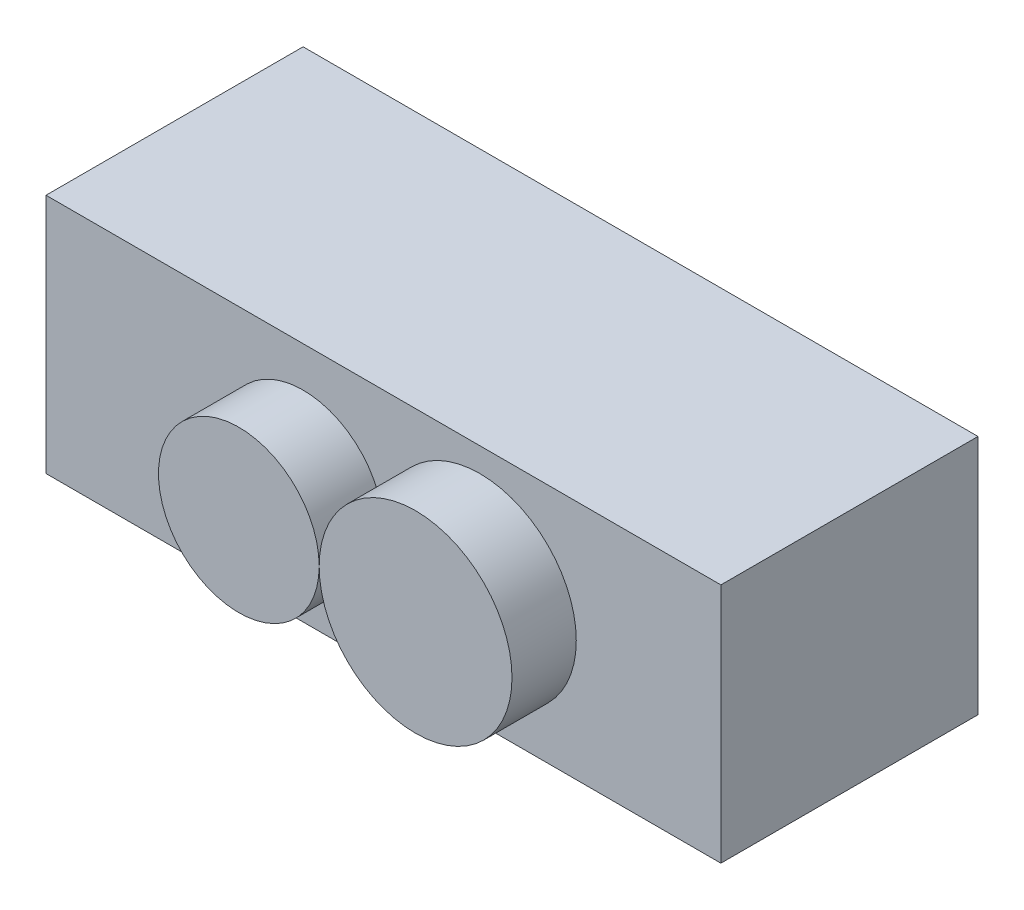
ISO-10303-21;
HEADER;
FILE_DESCRIPTION(('STEP AP214'),'2;1');
FILE_NAME('part.step','',(''),(''),'','','');
FILE_SCHEMA(('AUTOMOTIVE_DESIGN { 1 0 10303 214 1 1 1 1 }'));
ENDSEC;
DATA;
#1=APPLICATION_CONTEXT('core data for automotive mechanical design processes');
#2=APPLICATION_PROTOCOL_DEFINITION('international standard','automotive_design',2000,#1);
#3=PRODUCT_CONTEXT('',#1,'mechanical');
#4=PRODUCT('Part','Part','',(#3));
#5=PRODUCT_RELATED_PRODUCT_CATEGORY('part','',(#4));
#6=PRODUCT_DEFINITION_FORMATION('','',#4);
#7=PRODUCT_DEFINITION_CONTEXT('part definition',#1,'design');
#8=PRODUCT_DEFINITION('design','',#6,#7);
#9=PRODUCT_DEFINITION_SHAPE('','',#8);
#10=(LENGTH_UNIT() NAMED_UNIT(*) SI_UNIT(.MILLI.,.METRE.));
#11=(NAMED_UNIT(*) PLANE_ANGLE_UNIT() SI_UNIT($,.RADIAN.));
#12=(NAMED_UNIT(*) SI_UNIT($,.STERADIAN.) SOLID_ANGLE_UNIT());
#13=UNCERTAINTY_MEASURE_WITH_UNIT(LENGTH_MEASURE(1.E-05),#10,'distance_accuracy_value','');
#14=(GEOMETRIC_REPRESENTATION_CONTEXT(3) GLOBAL_UNCERTAINTY_ASSIGNED_CONTEXT((#13)) GLOBAL_UNIT_ASSIGNED_CONTEXT((#10,
#11,#12)) REPRESENTATION_CONTEXT('',''));
#15=CARTESIAN_POINT('',(0.,0.,0.));
#16=DIRECTION('',(0.,0.,1.));
#17=DIRECTION('',(1.,0.,0.));
#18=AXIS2_PLACEMENT_3D('',#15,#16,#17);
#19=CARTESIAN_POINT('',(-5.,0.,20.));
#20=DIRECTION('',(0.,0.,-1.));
#21=DIRECTION('',(-1.,0.,0.));
#22=AXIS2_PLACEMENT_3D('',#19,#20,#21);
#23=CYLINDRICAL_SURFACE('',#22,5.);
#24=CARTESIAN_POINT('',(-5.,0.,16.));
#25=DIRECTION('',(0.,0.,1.));
#26=DIRECTION('',(1.,0.,0.));
#27=AXIS2_PLACEMENT_3D('',#24,#25,#26);
#28=CIRCLE('',#27,5.);
#29=CARTESIAN_POINT('',(0.,0.,16.));
#30=VERTEX_POINT('',#29);
#31=EDGE_CURVE('E12',#30,#30,#28,.T.);
#32=ORIENTED_EDGE('',*,*,#31,.T.);
#33=EDGE_LOOP('',(#32));
#34=FACE_BOUND('',#33,.T.);
#35=CARTESIAN_POINT('',(-5.,0.,20.));
#36=DIRECTION('',(0.,0.,1.));
#37=DIRECTION('',(1.,0.,0.));
#38=AXIS2_PLACEMENT_3D('',#35,#36,#37);
#39=CIRCLE('',#38,5.);
#40=CARTESIAN_POINT('',(0.,0.,20.));
#41=VERTEX_POINT('',#40);
#42=EDGE_CURVE('E66',#41,#41,#39,.T.);
#43=ORIENTED_EDGE('',*,*,#42,.F.);
#44=EDGE_LOOP('',(#43));
#45=FACE_BOUND('',#44,.T.);
#46=ADVANCED_FACE('F62',(#34,#45),#23,.T.);
#47=CARTESIAN_POINT('',(-5.,0.,20.));
#48=DIRECTION('',(0.,0.,1.));
#49=DIRECTION('',(1.,0.,0.));
#50=AXIS2_PLACEMENT_3D('',#47,#48,#49);
#51=PLANE('',#50);
#52=ORIENTED_EDGE('',*,*,#42,.T.);
#53=EDGE_LOOP('',(#52));
#54=FACE_BOUND('',#53,.T.);
#55=ADVANCED_FACE('F64',(#54),#51,.T.);
#56=CARTESIAN_POINT('',(-5.,0.,16.));
#57=DIRECTION('',(0.,0.,1.));
#58=DIRECTION('',(1.,0.,0.));
#59=AXIS2_PLACEMENT_3D('',#56,#57,#58);
#60=PLANE('',#59);
#61=ORIENTED_EDGE('',*,*,#31,.F.);
#62=EDGE_LOOP('',(#61));
#63=FACE_BOUND('',#62,.T.);
#64=ADVANCED_FACE('F81',(#63),#60,.F.);
#65=CLOSED_SHELL('',(#46,#55,#64));
#66=MANIFOLD_SOLID_BREP('B2',#65);
#67=CARTESIAN_POINT('',(6.,0.,20.));
#68=DIRECTION('',(0.,0.,-1.));
#69=DIRECTION('',(-1.,0.,0.));
#70=AXIS2_PLACEMENT_3D('',#67,#68,#69);
#71=CYLINDRICAL_SURFACE('',#70,6.);
#72=CARTESIAN_POINT('',(6.,0.,16.));
#73=DIRECTION('',(0.,0.,1.));
#74=DIRECTION('',(1.,0.,0.));
#75=AXIS2_PLACEMENT_3D('',#72,#73,#74);
#76=CIRCLE('',#75,6.);
#77=CARTESIAN_POINT('',(12.,0.,16.));
#78=VERTEX_POINT('',#77);
#79=EDGE_CURVE('E115',#78,#78,#76,.T.);
#80=ORIENTED_EDGE('',*,*,#79,.T.);
#81=EDGE_LOOP('',(#80));
#82=FACE_BOUND('',#81,.T.);
#83=CARTESIAN_POINT('',(6.,0.,20.));
#84=DIRECTION('',(0.,0.,1.));
#85=DIRECTION('',(1.,0.,0.));
#86=AXIS2_PLACEMENT_3D('',#83,#84,#85);
#87=CIRCLE('',#86,6.);
#88=CARTESIAN_POINT('',(12.,0.,20.));
#89=VERTEX_POINT('',#88);
#90=EDGE_CURVE('E61',#89,#89,#87,.T.);
#91=ORIENTED_EDGE('',*,*,#90,.F.);
#92=EDGE_LOOP('',(#91));
#93=FACE_BOUND('',#92,.T.);
#94=ADVANCED_FACE('F112',(#82,#93),#71,.T.);
#95=CARTESIAN_POINT('',(6.,0.,20.));
#96=DIRECTION('',(0.,0.,1.));
#97=DIRECTION('',(1.,0.,0.));
#98=AXIS2_PLACEMENT_3D('',#95,#96,#97);
#99=PLANE('',#98);
#100=ORIENTED_EDGE('',*,*,#90,.T.);
#101=EDGE_LOOP('',(#100));
#102=FACE_BOUND('',#101,.T.);
#103=ADVANCED_FACE('F128',(#102),#99,.T.);
#104=CARTESIAN_POINT('',(6.,0.,16.));
#105=DIRECTION('',(0.,0.,1.));
#106=DIRECTION('',(1.,0.,0.));
#107=AXIS2_PLACEMENT_3D('',#104,#105,#106);
#108=PLANE('',#107);
#109=ORIENTED_EDGE('',*,*,#79,.F.);
#110=EDGE_LOOP('',(#109));
#111=FACE_BOUND('',#110,.T.);
#112=ADVANCED_FACE('F126',(#111),#108,.F.);
#113=CLOSED_SHELL('',(#94,#103,#112));
#114=MANIFOLD_SOLID_BREP('B7',#113);
#115=CARTESIAN_POINT('',(21.,-7.5,16.));
#116=DIRECTION('',(-1.,0.,0.));
#117=DIRECTION('',(0.,0.,1.));
#118=AXIS2_PLACEMENT_3D('',#115,#116,#117);
#119=PLANE('',#118);
#120=DIRECTION('',(0.,1.,0.));
#121=VECTOR('',#120,1.);
#122=CARTESIAN_POINT('',(21.,-7.5,0.));
#123=LINE('',#122,#121);
#124=CARTESIAN_POINT('',(21.,-7.5,0.));
#125=VERTEX_POINT('',#124);
#126=CARTESIAN_POINT('',(21.,7.5,0.));
#127=VERTEX_POINT('',#126);
#128=EDGE_CURVE('E221',#125,#127,#123,.T.);
#129=ORIENTED_EDGE('',*,*,#128,.T.);
#130=DIRECTION('',(0.,0.,-1.));
#131=VECTOR('',#130,1.);
#132=CARTESIAN_POINT('',(21.,7.5,16.));
#133=LINE('',#132,#131);
#134=CARTESIAN_POINT('',(21.,7.5,16.));
#135=VERTEX_POINT('',#134);
#136=EDGE_CURVE('E110',#135,#127,#133,.T.);
#137=ORIENTED_EDGE('',*,*,#136,.F.);
#138=DIRECTION('',(0.,1.,0.));
#139=VECTOR('',#138,1.);
#140=CARTESIAN_POINT('',(21.,-7.5,16.));
#141=LINE('',#140,#139);
#142=CARTESIAN_POINT('',(21.,-7.5,16.));
#143=VERTEX_POINT('',#142);
#144=EDGE_CURVE('E205',#143,#135,#141,.T.);
#145=ORIENTED_EDGE('',*,*,#144,.F.);
#146=DIRECTION('',(0.,0.,-1.));
#147=VECTOR('',#146,1.);
#148=CARTESIAN_POINT('',(21.,-7.5,16.));
#149=LINE('',#148,#147);
#150=EDGE_CURVE('E217',#143,#125,#149,.T.);
#151=ORIENTED_EDGE('',*,*,#150,.T.);
#152=EDGE_LOOP('',(#129,#137,#145,#151));
#153=FACE_BOUND('',#152,.T.);
#154=ADVANCED_FACE('F153',(#153),#119,.F.);
#155=CARTESIAN_POINT('',(-21.,7.5,16.));
#156=DIRECTION('',(0.,-1.,0.));
#157=DIRECTION('',(0.,0.,-1.));
#158=AXIS2_PLACEMENT_3D('',#155,#156,#157);
#159=PLANE('',#158);
#160=DIRECTION('',(-1.,0.,0.));
#161=VECTOR('',#160,1.);
#162=CARTESIAN_POINT('',(-21.,7.5,0.));
#163=LINE('',#162,#161);
#164=CARTESIAN_POINT('',(-21.,7.5,0.));
#165=VERTEX_POINT('',#164);
#166=EDGE_CURVE('E210',#127,#165,#163,.T.);
#167=ORIENTED_EDGE('',*,*,#166,.T.);
#168=DIRECTION('',(0.,0.,-1.));
#169=VECTOR('',#168,1.);
#170=CARTESIAN_POINT('',(-21.,7.5,16.));
#171=LINE('',#170,#169);
#172=CARTESIAN_POINT('',(-21.,7.5,16.));
#173=VERTEX_POINT('',#172);
#174=EDGE_CURVE('E162',#173,#165,#171,.T.);
#175=ORIENTED_EDGE('',*,*,#174,.F.);
#176=DIRECTION('',(-1.,0.,0.));
#177=VECTOR('',#176,1.);
#178=CARTESIAN_POINT('',(-21.,7.5,16.));
#179=LINE('',#178,#177);
#180=EDGE_CURVE('E200',#135,#173,#179,.T.);
#181=ORIENTED_EDGE('',*,*,#180,.F.);
#182=ORIENTED_EDGE('',*,*,#136,.T.);
#183=EDGE_LOOP('',(#167,#175,#181,#182));
#184=FACE_BOUND('',#183,.T.);
#185=ADVANCED_FACE('F209',(#184),#159,.F.);
#186=CARTESIAN_POINT('',(-21.,-7.5,16.));
#187=DIRECTION('',(1.,0.,0.));
#188=DIRECTION('',(0.,0.,-1.));
#189=AXIS2_PLACEMENT_3D('',#186,#187,#188);
#190=PLANE('',#189);
#191=DIRECTION('',(0.,-1.,0.));
#192=VECTOR('',#191,1.);
#193=CARTESIAN_POINT('',(-21.,-7.5,0.));
#194=LINE('',#193,#192);
#195=CARTESIAN_POINT('',(-21.,-7.5,0.));
#196=VERTEX_POINT('',#195);
#197=EDGE_CURVE('E187',#165,#196,#194,.T.);
#198=ORIENTED_EDGE('',*,*,#197,.T.);
#199=DIRECTION('',(0.,0.,-1.));
#200=VECTOR('',#199,1.);
#201=CARTESIAN_POINT('',(-21.,-7.5,16.));
#202=LINE('',#201,#200);
#203=CARTESIAN_POINT('',(-21.,-7.5,16.));
#204=VERTEX_POINT('',#203);
#205=EDGE_CURVE('E212',#204,#196,#202,.T.);
#206=ORIENTED_EDGE('',*,*,#205,.F.);
#207=DIRECTION('',(0.,-1.,0.));
#208=VECTOR('',#207,1.);
#209=CARTESIAN_POINT('',(-21.,-7.5,16.));
#210=LINE('',#209,#208);
#211=EDGE_CURVE('E203',#173,#204,#210,.T.);
#212=ORIENTED_EDGE('',*,*,#211,.F.);
#213=ORIENTED_EDGE('',*,*,#174,.T.);
#214=EDGE_LOOP('',(#198,#206,#212,#213));
#215=FACE_BOUND('',#214,.T.);
#216=ADVANCED_FACE('F213',(#215),#190,.F.);
#217=CARTESIAN_POINT('',(-21.,-7.5,16.));
#218=DIRECTION('',(0.,1.,0.));
#219=DIRECTION('',(0.,0.,1.));
#220=AXIS2_PLACEMENT_3D('',#217,#218,#219);
#221=PLANE('',#220);
#222=DIRECTION('',(1.,0.,0.));
#223=VECTOR('',#222,1.);
#224=CARTESIAN_POINT('',(-21.,-7.5,0.));
#225=LINE('',#224,#223);
#226=EDGE_CURVE('E193',#196,#125,#225,.T.);
#227=ORIENTED_EDGE('',*,*,#226,.T.);
#228=ORIENTED_EDGE('',*,*,#150,.F.);
#229=DIRECTION('',(1.,0.,0.));
#230=VECTOR('',#229,1.);
#231=CARTESIAN_POINT('',(-21.,-7.5,16.));
#232=LINE('',#231,#230);
#233=EDGE_CURVE('E170',#204,#143,#232,.T.);
#234=ORIENTED_EDGE('',*,*,#233,.F.);
#235=ORIENTED_EDGE('',*,*,#205,.T.);
#236=EDGE_LOOP('',(#227,#228,#234,#235));
#237=FACE_BOUND('',#236,.T.);
#238=ADVANCED_FACE('F234',(#237),#221,.F.);
#239=CARTESIAN_POINT('',(0.,0.,16.));
#240=DIRECTION('',(0.,0.,-1.));
#241=DIRECTION('',(-1.,0.,0.));
#242=AXIS2_PLACEMENT_3D('',#239,#240,#241);
#243=PLANE('',#242);
#244=ORIENTED_EDGE('',*,*,#144,.T.);
#245=ORIENTED_EDGE('',*,*,#180,.T.);
#246=ORIENTED_EDGE('',*,*,#211,.T.);
#247=ORIENTED_EDGE('',*,*,#233,.T.);
#248=EDGE_LOOP('',(#244,#245,#246,#247));
#249=FACE_BOUND('',#248,.T.);
#250=ADVANCED_FACE('F201',(#249),#243,.F.);
#251=CARTESIAN_POINT('',(0.,0.,0.));
#252=DIRECTION('',(0.,0.,-1.));
#253=DIRECTION('',(-1.,0.,0.));
#254=AXIS2_PLACEMENT_3D('',#251,#252,#253);
#255=PLANE('',#254);
#256=ORIENTED_EDGE('',*,*,#128,.F.);
#257=ORIENTED_EDGE('',*,*,#226,.F.);
#258=ORIENTED_EDGE('',*,*,#197,.F.);
#259=ORIENTED_EDGE('',*,*,#166,.F.);
#260=EDGE_LOOP('',(#256,#257,#258,#259));
#261=FACE_BOUND('',#260,.T.);
#262=ADVANCED_FACE('F237',(#261),#255,.T.);
#263=CLOSED_SHELL('',(#154,#185,#216,#238,#250,#262));
#264=MANIFOLD_SOLID_BREP('B56',#263);
#265=ADVANCED_BREP_SHAPE_REPRESENTATION('',(#18,#66,#114,#264),#14);
#266=SHAPE_DEFINITION_REPRESENTATION(#9,#265);
ENDSEC;
END-ISO-10303-21;
